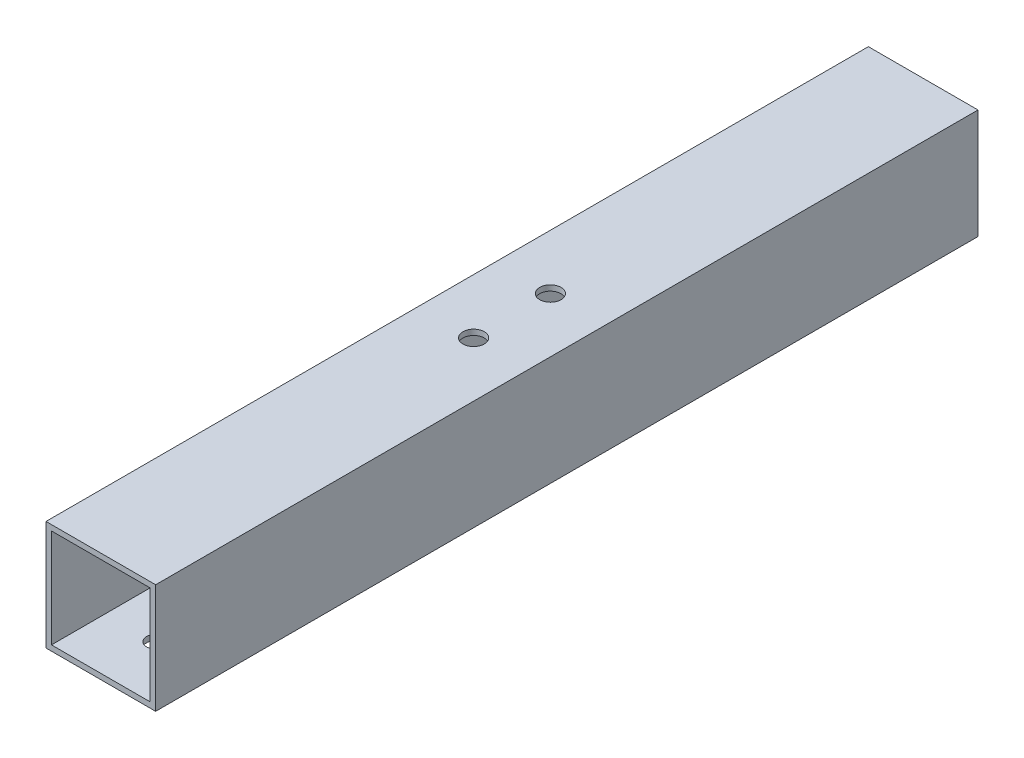
ISO-10303-21;
HEADER;
FILE_DESCRIPTION(('STEP AP214'),'2;1');
FILE_NAME('part.step','',(''),(''),'','','');
FILE_SCHEMA(('AUTOMOTIVE_DESIGN { 1 0 10303 214 1 1 1 1 }'));
ENDSEC;
DATA;
#1=APPLICATION_CONTEXT('core data for automotive mechanical design processes');
#2=APPLICATION_PROTOCOL_DEFINITION('international standard','automotive_design',2000,#1);
#3=PRODUCT_CONTEXT('',#1,'mechanical');
#4=PRODUCT('Part','Part','',(#3));
#5=PRODUCT_RELATED_PRODUCT_CATEGORY('part','',(#4));
#6=PRODUCT_DEFINITION_FORMATION('','',#4);
#7=PRODUCT_DEFINITION_CONTEXT('part definition',#1,'design');
#8=PRODUCT_DEFINITION('design','',#6,#7);
#9=PRODUCT_DEFINITION_SHAPE('','',#8);
#10=(LENGTH_UNIT() NAMED_UNIT(*) SI_UNIT(.MILLI.,.METRE.));
#11=(NAMED_UNIT(*) PLANE_ANGLE_UNIT() SI_UNIT($,.RADIAN.));
#12=(NAMED_UNIT(*) SI_UNIT($,.STERADIAN.) SOLID_ANGLE_UNIT());
#13=UNCERTAINTY_MEASURE_WITH_UNIT(LENGTH_MEASURE(1.E-05),#10,'distance_accuracy_value','');
#14=(GEOMETRIC_REPRESENTATION_CONTEXT(3) GLOBAL_UNCERTAINTY_ASSIGNED_CONTEXT((#13)) GLOBAL_UNIT_ASSIGNED_CONTEXT((#10,
#11,#12)) REPRESENTATION_CONTEXT('',''));
#15=CARTESIAN_POINT('',(0.,0.,0.));
#16=DIRECTION('',(0.,0.,1.));
#17=DIRECTION('',(1.,0.,0.));
#18=AXIS2_PLACEMENT_3D('',#15,#16,#17);
#19=CARTESIAN_POINT('',(0.,0.,150.));
#20=DIRECTION('',(0.,0.,1.));
#21=DIRECTION('',(1.,0.,0.));
#22=AXIS2_PLACEMENT_3D('',#19,#20,#21);
#23=PLANE('',#22);
#24=DIRECTION('',(0.,-1.,0.));
#25=VECTOR('',#24,1.);
#26=CARTESIAN_POINT('',(0.,0.,150.));
#27=LINE('',#26,#25);
#28=CARTESIAN_POINT('',(0.,0.,150.));
#29=VERTEX_POINT('',#28);
#30=CARTESIAN_POINT('',(0.,-20.,150.));
#31=VERTEX_POINT('',#30);
#32=EDGE_CURVE('E170',#29,#31,#27,.T.);
#33=ORIENTED_EDGE('',*,*,#32,.T.);
#34=DIRECTION('',(1.,0.,0.));
#35=VECTOR('',#34,1.);
#36=CARTESIAN_POINT('',(0.,-20.,150.));
#37=LINE('',#36,#35);
#38=CARTESIAN_POINT('',(20.,-20.,150.));
#39=VERTEX_POINT('',#38);
#40=EDGE_CURVE('E173',#31,#39,#37,.T.);
#41=ORIENTED_EDGE('',*,*,#40,.T.);
#42=DIRECTION('',(0.,1.,0.));
#43=VECTOR('',#42,1.);
#44=CARTESIAN_POINT('',(20.,0.,150.));
#45=LINE('',#44,#43);
#46=CARTESIAN_POINT('',(20.,0.,150.));
#47=VERTEX_POINT('',#46);
#48=EDGE_CURVE('E176',#39,#47,#45,.T.);
#49=ORIENTED_EDGE('',*,*,#48,.T.);
#50=DIRECTION('',(-1.,0.,0.));
#51=VECTOR('',#50,1.);
#52=CARTESIAN_POINT('',(0.,0.,150.));
#53=LINE('',#52,#51);
#54=EDGE_CURVE('E178',#47,#29,#53,.T.);
#55=ORIENTED_EDGE('',*,*,#54,.T.);
#56=EDGE_LOOP('',(#33,#41,#49,#55));
#57=FACE_BOUND('',#56,.T.);
#58=DIRECTION('',(1.,0.,0.));
#59=VECTOR('',#58,1.);
#60=CARTESIAN_POINT('',(0.,-19.,150.));
#61=LINE('',#60,#59);
#62=CARTESIAN_POINT('',(1.,-19.,150.));
#63=VERTEX_POINT('',#62);
#64=CARTESIAN_POINT('',(19.,-19.,150.));
#65=VERTEX_POINT('',#64);
#66=EDGE_CURVE('E140',#63,#65,#61,.T.);
#67=ORIENTED_EDGE('',*,*,#66,.F.);
#68=DIRECTION('',(0.,-1.,0.));
#69=VECTOR('',#68,1.);
#70=CARTESIAN_POINT('',(1.,0.,150.));
#71=LINE('',#70,#69);
#72=CARTESIAN_POINT('',(1.,-1.,150.));
#73=VERTEX_POINT('',#72);
#74=EDGE_CURVE('E132',#73,#63,#71,.T.);
#75=ORIENTED_EDGE('',*,*,#74,.F.);
#76=DIRECTION('',(-1.,0.,0.));
#77=VECTOR('',#76,1.);
#78=CARTESIAN_POINT('',(0.,-1.,150.));
#79=LINE('',#78,#77);
#80=CARTESIAN_POINT('',(19.,-1.,150.));
#81=VERTEX_POINT('',#80);
#82=EDGE_CURVE('E154',#81,#73,#79,.T.);
#83=ORIENTED_EDGE('',*,*,#82,.F.);
#84=DIRECTION('',(0.,1.,0.));
#85=VECTOR('',#84,1.);
#86=CARTESIAN_POINT('',(19.,0.,150.));
#87=LINE('',#86,#85);
#88=EDGE_CURVE('E152',#65,#81,#87,.T.);
#89=ORIENTED_EDGE('',*,*,#88,.F.);
#90=EDGE_LOOP('',(#67,#75,#83,#89));
#91=FACE_BOUND('',#90,.T.);
#92=ADVANCED_FACE('F65',(#57,#91),#23,.T.);
#93=CARTESIAN_POINT('',(0.,0.,0.));
#94=DIRECTION('',(0.,0.,1.));
#95=DIRECTION('',(1.,0.,0.));
#96=AXIS2_PLACEMENT_3D('',#93,#94,#95);
#97=PLANE('',#96);
#98=DIRECTION('',(0.,-1.,0.));
#99=VECTOR('',#98,1.);
#100=CARTESIAN_POINT('',(0.,0.,0.));
#101=LINE('',#100,#99);
#102=CARTESIAN_POINT('',(0.,0.,0.));
#103=VERTEX_POINT('',#102);
#104=CARTESIAN_POINT('',(0.,-20.,0.));
#105=VERTEX_POINT('',#104);
#106=EDGE_CURVE('E148',#103,#105,#101,.T.);
#107=ORIENTED_EDGE('',*,*,#106,.F.);
#108=DIRECTION('',(-1.,0.,0.));
#109=VECTOR('',#108,1.);
#110=CARTESIAN_POINT('',(0.,0.,0.));
#111=LINE('',#110,#109);
#112=CARTESIAN_POINT('',(20.,0.,0.));
#113=VERTEX_POINT('',#112);
#114=EDGE_CURVE('E174',#113,#103,#111,.T.);
#115=ORIENTED_EDGE('',*,*,#114,.F.);
#116=DIRECTION('',(0.,1.,0.));
#117=VECTOR('',#116,1.);
#118=CARTESIAN_POINT('',(20.,0.,0.));
#119=LINE('',#118,#117);
#120=CARTESIAN_POINT('',(20.,-20.,0.));
#121=VERTEX_POINT('',#120);
#122=EDGE_CURVE('E185',#121,#113,#119,.T.);
#123=ORIENTED_EDGE('',*,*,#122,.F.);
#124=DIRECTION('',(1.,0.,0.));
#125=VECTOR('',#124,1.);
#126=CARTESIAN_POINT('',(0.,-20.,0.));
#127=LINE('',#126,#125);
#128=EDGE_CURVE('E183',#105,#121,#127,.T.);
#129=ORIENTED_EDGE('',*,*,#128,.F.);
#130=EDGE_LOOP('',(#107,#115,#123,#129));
#131=FACE_BOUND('',#130,.T.);
#132=DIRECTION('',(0.,-1.,0.));
#133=VECTOR('',#132,1.);
#134=CARTESIAN_POINT('',(1.,0.,0.));
#135=LINE('',#134,#133);
#136=CARTESIAN_POINT('',(1.,-1.,0.));
#137=VERTEX_POINT('',#136);
#138=CARTESIAN_POINT('',(1.,-19.,0.));
#139=VERTEX_POINT('',#138);
#140=EDGE_CURVE('E90',#137,#139,#135,.T.);
#141=ORIENTED_EDGE('',*,*,#140,.T.);
#142=DIRECTION('',(1.,0.,0.));
#143=VECTOR('',#142,1.);
#144=CARTESIAN_POINT('',(0.,-19.,0.));
#145=LINE('',#144,#143);
#146=CARTESIAN_POINT('',(19.,-19.,0.));
#147=VERTEX_POINT('',#146);
#148=EDGE_CURVE('E147',#139,#147,#145,.T.);
#149=ORIENTED_EDGE('',*,*,#148,.T.);
#150=DIRECTION('',(0.,1.,0.));
#151=VECTOR('',#150,1.);
#152=CARTESIAN_POINT('',(19.,0.,0.));
#153=LINE('',#152,#151);
#154=CARTESIAN_POINT('',(19.,-1.,0.));
#155=VERTEX_POINT('',#154);
#156=EDGE_CURVE('E162',#147,#155,#153,.T.);
#157=ORIENTED_EDGE('',*,*,#156,.T.);
#158=DIRECTION('',(-1.,0.,0.));
#159=VECTOR('',#158,1.);
#160=CARTESIAN_POINT('',(0.,-1.,0.));
#161=LINE('',#160,#159);
#162=EDGE_CURVE('E141',#155,#137,#161,.T.);
#163=ORIENTED_EDGE('',*,*,#162,.T.);
#164=EDGE_LOOP('',(#141,#149,#157,#163));
#165=FACE_BOUND('',#164,.T.);
#166=ADVANCED_FACE('F236',(#131,#165),#97,.F.);
#167=CARTESIAN_POINT('',(0.,0.,150.));
#168=DIRECTION('',(1.,0.,0.));
#169=DIRECTION('',(0.,1.,0.));
#170=AXIS2_PLACEMENT_3D('',#167,#168,#169);
#171=PLANE('',#170);
#172=ORIENTED_EDGE('',*,*,#106,.T.);
#173=DIRECTION('',(0.,0.,-1.));
#174=VECTOR('',#173,1.);
#175=CARTESIAN_POINT('',(0.,-20.,150.));
#176=LINE('',#175,#174);
#177=EDGE_CURVE('E12',#31,#105,#176,.T.);
#178=ORIENTED_EDGE('',*,*,#177,.F.);
#179=ORIENTED_EDGE('',*,*,#32,.F.);
#180=DIRECTION('',(0.,0.,-1.));
#181=VECTOR('',#180,1.);
#182=CARTESIAN_POINT('',(0.,0.,150.));
#183=LINE('',#182,#181);
#184=EDGE_CURVE('E180',#29,#103,#183,.T.);
#185=ORIENTED_EDGE('',*,*,#184,.T.);
#186=EDGE_LOOP('',(#172,#178,#179,#185));
#187=FACE_BOUND('',#186,.T.);
#188=ADVANCED_FACE('F67',(#187),#171,.F.);
#189=CARTESIAN_POINT('',(0.,-20.,150.));
#190=DIRECTION('',(0.,1.,0.));
#191=DIRECTION('',(0.,0.,1.));
#192=AXIS2_PLACEMENT_3D('',#189,#190,#191);
#193=PLANE('',#192);
#194=CARTESIAN_POINT('',(10.,-20.,140.));
#195=DIRECTION('',(0.,-1.,0.));
#196=DIRECTION('',(0.,0.,-1.));
#197=AXIS2_PLACEMENT_3D('',#194,#195,#196);
#198=CIRCLE('',#197,1.65000000000001);
#199=CARTESIAN_POINT('',(10.,-20.,138.35));
#200=VERTEX_POINT('',#199);
#201=EDGE_CURVE('E218',#200,#200,#198,.T.);
#202=ORIENTED_EDGE('',*,*,#201,.F.);
#203=EDGE_LOOP('',(#202));
#204=FACE_BOUND('',#203,.T.);
#205=CARTESIAN_POINT('',(10.,-20.,9.99999999999998));
#206=DIRECTION('',(0.,-1.,0.));
#207=DIRECTION('',(0.,0.,-1.));
#208=AXIS2_PLACEMENT_3D('',#205,#206,#207);
#209=CIRCLE('',#208,1.65000000000001);
#210=CARTESIAN_POINT('',(10.,-20.,8.34999999999997));
#211=VERTEX_POINT('',#210);
#212=EDGE_CURVE('E276',#211,#211,#209,.T.);
#213=ORIENTED_EDGE('',*,*,#212,.F.);
#214=EDGE_LOOP('',(#213));
#215=FACE_BOUND('',#214,.T.);
#216=CARTESIAN_POINT('',(10.,-20.,82.));
#217=DIRECTION('',(0.,-1.,0.));
#218=DIRECTION('',(0.,0.,-1.));
#219=AXIS2_PLACEMENT_3D('',#216,#217,#218);
#220=CIRCLE('',#219,1.95);
#221=CARTESIAN_POINT('',(10.,-20.,80.05));
#222=VERTEX_POINT('',#221);
#223=EDGE_CURVE('E203',#222,#222,#220,.T.);
#224=ORIENTED_EDGE('',*,*,#223,.F.);
#225=EDGE_LOOP('',(#224));
#226=FACE_BOUND('',#225,.T.);
#227=CARTESIAN_POINT('',(10.,-20.,68.));
#228=DIRECTION('',(0.,-1.,0.));
#229=DIRECTION('',(0.,0.,-1.));
#230=AXIS2_PLACEMENT_3D('',#227,#228,#229);
#231=CIRCLE('',#230,1.95);
#232=CARTESIAN_POINT('',(10.,-20.,66.05));
#233=VERTEX_POINT('',#232);
#234=EDGE_CURVE('E208',#233,#233,#231,.T.);
#235=ORIENTED_EDGE('',*,*,#234,.F.);
#236=EDGE_LOOP('',(#235));
#237=FACE_BOUND('',#236,.T.);
#238=ORIENTED_EDGE('',*,*,#128,.T.);
#239=DIRECTION('',(0.,0.,-1.));
#240=VECTOR('',#239,1.);
#241=CARTESIAN_POINT('',(20.,-20.,150.));
#242=LINE('',#241,#240);
#243=EDGE_CURVE('E74',#39,#121,#242,.T.);
#244=ORIENTED_EDGE('',*,*,#243,.F.);
#245=ORIENTED_EDGE('',*,*,#40,.F.);
#246=ORIENTED_EDGE('',*,*,#177,.T.);
#247=EDGE_LOOP('',(#238,#244,#245,#246));
#248=FACE_BOUND('',#247,.T.);
#249=ADVANCED_FACE('F261',(#204,#215,#226,#237,#248),#193,.F.);
#250=CARTESIAN_POINT('',(20.,0.,150.));
#251=DIRECTION('',(-1.,0.,0.));
#252=DIRECTION('',(0.,-1.,0.));
#253=AXIS2_PLACEMENT_3D('',#250,#251,#252);
#254=PLANE('',#253);
#255=ORIENTED_EDGE('',*,*,#122,.T.);
#256=DIRECTION('',(0.,0.,-1.));
#257=VECTOR('',#256,1.);
#258=CARTESIAN_POINT('',(20.,0.,150.));
#259=LINE('',#258,#257);
#260=EDGE_CURVE('E190',#47,#113,#259,.T.);
#261=ORIENTED_EDGE('',*,*,#260,.F.);
#262=ORIENTED_EDGE('',*,*,#48,.F.);
#263=ORIENTED_EDGE('',*,*,#243,.T.);
#264=EDGE_LOOP('',(#255,#261,#262,#263));
#265=FACE_BOUND('',#264,.T.);
#266=ADVANCED_FACE('F259',(#265),#254,.F.);
#267=CARTESIAN_POINT('',(0.,0.,150.));
#268=DIRECTION('',(0.,-1.,0.));
#269=DIRECTION('',(0.,0.,-1.));
#270=AXIS2_PLACEMENT_3D('',#267,#268,#269);
#271=PLANE('',#270);
#272=CARTESIAN_POINT('',(10.,0.,82.));
#273=DIRECTION('',(0.,-1.,0.));
#274=DIRECTION('',(0.,0.,-1.));
#275=AXIS2_PLACEMENT_3D('',#272,#273,#274);
#276=CIRCLE('',#275,1.95);
#277=CARTESIAN_POINT('',(10.,0.,80.05));
#278=VERTEX_POINT('',#277);
#279=EDGE_CURVE('E197',#278,#278,#276,.T.);
#280=ORIENTED_EDGE('',*,*,#279,.T.);
#281=EDGE_LOOP('',(#280));
#282=FACE_BOUND('',#281,.T.);
#283=CARTESIAN_POINT('',(10.,0.,68.));
#284=DIRECTION('',(0.,-1.,0.));
#285=DIRECTION('',(0.,0.,-1.));
#286=AXIS2_PLACEMENT_3D('',#283,#284,#285);
#287=CIRCLE('',#286,1.95);
#288=CARTESIAN_POINT('',(10.,0.,66.05));
#289=VERTEX_POINT('',#288);
#290=EDGE_CURVE('E216',#289,#289,#287,.T.);
#291=ORIENTED_EDGE('',*,*,#290,.T.);
#292=EDGE_LOOP('',(#291));
#293=FACE_BOUND('',#292,.T.);
#294=ORIENTED_EDGE('',*,*,#114,.T.);
#295=ORIENTED_EDGE('',*,*,#184,.F.);
#296=ORIENTED_EDGE('',*,*,#54,.F.);
#297=ORIENTED_EDGE('',*,*,#260,.T.);
#298=EDGE_LOOP('',(#294,#295,#296,#297));
#299=FACE_BOUND('',#298,.T.);
#300=ADVANCED_FACE('F257',(#282,#293,#299),#271,.F.);
#301=CARTESIAN_POINT('',(1.,0.,150.));
#302=DIRECTION('',(1.,0.,0.));
#303=DIRECTION('',(0.,1.,0.));
#304=AXIS2_PLACEMENT_3D('',#301,#302,#303);
#305=PLANE('',#304);
#306=ORIENTED_EDGE('',*,*,#140,.F.);
#307=DIRECTION('',(0.,0.,-1.));
#308=VECTOR('',#307,1.);
#309=CARTESIAN_POINT('',(1.,-1.,150.));
#310=LINE('',#309,#308);
#311=EDGE_CURVE('E136',#73,#137,#310,.T.);
#312=ORIENTED_EDGE('',*,*,#311,.F.);
#313=ORIENTED_EDGE('',*,*,#74,.T.);
#314=DIRECTION('',(0.,0.,-1.));
#315=VECTOR('',#314,1.);
#316=CARTESIAN_POINT('',(1.,-19.,150.));
#317=LINE('',#316,#315);
#318=EDGE_CURVE('E135',#63,#139,#317,.T.);
#319=ORIENTED_EDGE('',*,*,#318,.T.);
#320=EDGE_LOOP('',(#306,#312,#313,#319));
#321=FACE_BOUND('',#320,.T.);
#322=ADVANCED_FACE('F134',(#321),#305,.T.);
#323=CARTESIAN_POINT('',(0.,-19.,150.));
#324=DIRECTION('',(0.,1.,0.));
#325=DIRECTION('',(0.,0.,1.));
#326=AXIS2_PLACEMENT_3D('',#323,#324,#325);
#327=PLANE('',#326);
#328=CARTESIAN_POINT('',(10.,-19.,140.));
#329=DIRECTION('',(0.,1.,0.));
#330=DIRECTION('',(0.,0.,1.));
#331=AXIS2_PLACEMENT_3D('',#328,#329,#330);
#332=CIRCLE('',#331,1.65000000000001);
#333=CARTESIAN_POINT('',(10.,-19.,141.65));
#334=VERTEX_POINT('',#333);
#335=EDGE_CURVE('E352',#334,#334,#332,.F.);
#336=ORIENTED_EDGE('',*,*,#335,.T.);
#337=EDGE_LOOP('',(#336));
#338=FACE_BOUND('',#337,.T.);
#339=CARTESIAN_POINT('',(10.,-19.,9.99999999999998));
#340=DIRECTION('',(0.,1.,0.));
#341=DIRECTION('',(0.,0.,1.));
#342=AXIS2_PLACEMENT_3D('',#339,#340,#341);
#343=CIRCLE('',#342,1.65000000000001);
#344=CARTESIAN_POINT('',(10.,-19.,11.65));
#345=VERTEX_POINT('',#344);
#346=EDGE_CURVE('E211',#345,#345,#343,.F.);
#347=ORIENTED_EDGE('',*,*,#346,.T.);
#348=EDGE_LOOP('',(#347));
#349=FACE_BOUND('',#348,.T.);
#350=CARTESIAN_POINT('',(10.,-19.,82.));
#351=DIRECTION('',(0.,1.,0.));
#352=DIRECTION('',(0.,0.,1.));
#353=AXIS2_PLACEMENT_3D('',#350,#351,#352);
#354=CIRCLE('',#353,1.95);
#355=CARTESIAN_POINT('',(10.,-19.,83.95));
#356=VERTEX_POINT('',#355);
#357=EDGE_CURVE('E160',#356,#356,#354,.T.);
#358=ORIENTED_EDGE('',*,*,#357,.F.);
#359=EDGE_LOOP('',(#358));
#360=FACE_BOUND('',#359,.T.);
#361=CARTESIAN_POINT('',(10.,-19.,68.));
#362=DIRECTION('',(0.,1.,0.));
#363=DIRECTION('',(0.,0.,1.));
#364=AXIS2_PLACEMENT_3D('',#361,#362,#363);
#365=CIRCLE('',#364,1.95);
#366=CARTESIAN_POINT('',(10.,-19.,69.95));
#367=VERTEX_POINT('',#366);
#368=EDGE_CURVE('E196',#367,#367,#365,.T.);
#369=ORIENTED_EDGE('',*,*,#368,.F.);
#370=EDGE_LOOP('',(#369));
#371=FACE_BOUND('',#370,.T.);
#372=ORIENTED_EDGE('',*,*,#148,.F.);
#373=ORIENTED_EDGE('',*,*,#318,.F.);
#374=ORIENTED_EDGE('',*,*,#66,.T.);
#375=DIRECTION('',(0.,0.,-1.));
#376=VECTOR('',#375,1.);
#377=CARTESIAN_POINT('',(19.,-19.,150.));
#378=LINE('',#377,#376);
#379=EDGE_CURVE('E149',#65,#147,#378,.T.);
#380=ORIENTED_EDGE('',*,*,#379,.T.);
#381=EDGE_LOOP('',(#372,#373,#374,#380));
#382=FACE_BOUND('',#381,.T.);
#383=ADVANCED_FACE('F144',(#338,#349,#360,#371,#382),#327,.T.);
#384=CARTESIAN_POINT('',(19.,0.,150.));
#385=DIRECTION('',(-1.,0.,0.));
#386=DIRECTION('',(0.,-1.,0.));
#387=AXIS2_PLACEMENT_3D('',#384,#385,#386);
#388=PLANE('',#387);
#389=ORIENTED_EDGE('',*,*,#156,.F.);
#390=ORIENTED_EDGE('',*,*,#379,.F.);
#391=ORIENTED_EDGE('',*,*,#88,.T.);
#392=DIRECTION('',(0.,0.,-1.));
#393=VECTOR('',#392,1.);
#394=CARTESIAN_POINT('',(19.,-1.,150.));
#395=LINE('',#394,#393);
#396=EDGE_CURVE('E82',#81,#155,#395,.T.);
#397=ORIENTED_EDGE('',*,*,#396,.T.);
#398=EDGE_LOOP('',(#389,#390,#391,#397));
#399=FACE_BOUND('',#398,.T.);
#400=ADVANCED_FACE('F232',(#399),#388,.T.);
#401=CARTESIAN_POINT('',(0.,-1.,150.));
#402=DIRECTION('',(0.,-1.,0.));
#403=DIRECTION('',(0.,0.,-1.));
#404=AXIS2_PLACEMENT_3D('',#401,#402,#403);
#405=PLANE('',#404);
#406=CARTESIAN_POINT('',(10.,-1.,82.));
#407=DIRECTION('',(0.,-1.,0.));
#408=DIRECTION('',(0.,0.,-1.));
#409=AXIS2_PLACEMENT_3D('',#406,#407,#408);
#410=CIRCLE('',#409,1.95);
#411=CARTESIAN_POINT('',(10.,-1.,80.05));
#412=VERTEX_POINT('',#411);
#413=EDGE_CURVE('E69',#412,#412,#410,.T.);
#414=ORIENTED_EDGE('',*,*,#413,.F.);
#415=EDGE_LOOP('',(#414));
#416=FACE_BOUND('',#415,.T.);
#417=CARTESIAN_POINT('',(10.,-1.,68.));
#418=DIRECTION('',(0.,-1.,0.));
#419=DIRECTION('',(0.,0.,-1.));
#420=AXIS2_PLACEMENT_3D('',#417,#418,#419);
#421=CIRCLE('',#420,1.95);
#422=CARTESIAN_POINT('',(10.,-1.,66.05));
#423=VERTEX_POINT('',#422);
#424=EDGE_CURVE('E194',#423,#423,#421,.T.);
#425=ORIENTED_EDGE('',*,*,#424,.F.);
#426=EDGE_LOOP('',(#425));
#427=FACE_BOUND('',#426,.T.);
#428=ORIENTED_EDGE('',*,*,#162,.F.);
#429=ORIENTED_EDGE('',*,*,#396,.F.);
#430=ORIENTED_EDGE('',*,*,#82,.T.);
#431=ORIENTED_EDGE('',*,*,#311,.T.);
#432=EDGE_LOOP('',(#428,#429,#430,#431));
#433=FACE_BOUND('',#432,.T.);
#434=ADVANCED_FACE('F228',(#416,#427,#433),#405,.T.);
#435=CARTESIAN_POINT('',(10.,0.,68.));
#436=DIRECTION('',(0.,-1.,0.));
#437=DIRECTION('',(0.,0.,-1.));
#438=AXIS2_PLACEMENT_3D('',#435,#436,#437);
#439=CYLINDRICAL_SURFACE('',#438,1.95);
#440=ORIENTED_EDGE('',*,*,#424,.T.);
#441=EDGE_LOOP('',(#440));
#442=FACE_BOUND('',#441,.T.);
#443=ORIENTED_EDGE('',*,*,#290,.F.);
#444=EDGE_LOOP('',(#443));
#445=FACE_BOUND('',#444,.T.);
#446=ADVANCED_FACE('F231',(#442,#445),#439,.F.);
#447=CARTESIAN_POINT('',(10.,0.,82.));
#448=DIRECTION('',(0.,-1.,0.));
#449=DIRECTION('',(0.,0.,-1.));
#450=AXIS2_PLACEMENT_3D('',#447,#448,#449);
#451=CYLINDRICAL_SURFACE('',#450,1.95);
#452=ORIENTED_EDGE('',*,*,#413,.T.);
#453=EDGE_LOOP('',(#452));
#454=FACE_BOUND('',#453,.T.);
#455=ORIENTED_EDGE('',*,*,#279,.F.);
#456=EDGE_LOOP('',(#455));
#457=FACE_BOUND('',#456,.T.);
#458=ADVANCED_FACE('F225',(#454,#457),#451,.F.);
#459=ORIENTED_EDGE('',*,*,#368,.T.);
#460=EDGE_LOOP('',(#459));
#461=FACE_BOUND('',#460,.T.);
#462=ORIENTED_EDGE('',*,*,#234,.T.);
#463=EDGE_LOOP('',(#462));
#464=FACE_BOUND('',#463,.T.);
#465=ADVANCED_FACE('F293',(#461,#464),#439,.F.);
#466=ORIENTED_EDGE('',*,*,#357,.T.);
#467=EDGE_LOOP('',(#466));
#468=FACE_BOUND('',#467,.T.);
#469=ORIENTED_EDGE('',*,*,#223,.T.);
#470=EDGE_LOOP('',(#469));
#471=FACE_BOUND('',#470,.T.);
#472=ADVANCED_FACE('F295',(#468,#471),#451,.F.);
#473=CARTESIAN_POINT('',(10.,0.001000000000001,9.99999999999998));
#474=DIRECTION('',(0.,-1.,0.));
#475=DIRECTION('',(0.,0.,-1.));
#476=AXIS2_PLACEMENT_3D('',#473,#474,#475);
#477=CYLINDRICAL_SURFACE('',#476,1.65000000000001);
#478=ORIENTED_EDGE('',*,*,#346,.F.);
#479=EDGE_LOOP('',(#478));
#480=FACE_BOUND('',#479,.T.);
#481=ORIENTED_EDGE('',*,*,#212,.T.);
#482=EDGE_LOOP('',(#481));
#483=FACE_BOUND('',#482,.T.);
#484=ADVANCED_FACE('F301',(#480,#483),#477,.F.);
#485=CARTESIAN_POINT('',(10.,0.001000000000001,140.));
#486=DIRECTION('',(0.,-1.,0.));
#487=DIRECTION('',(0.,0.,-1.));
#488=AXIS2_PLACEMENT_3D('',#485,#486,#487);
#489=CYLINDRICAL_SURFACE('',#488,1.65000000000001);
#490=ORIENTED_EDGE('',*,*,#335,.F.);
#491=EDGE_LOOP('',(#490));
#492=FACE_BOUND('',#491,.T.);
#493=ORIENTED_EDGE('',*,*,#201,.T.);
#494=EDGE_LOOP('',(#493));
#495=FACE_BOUND('',#494,.T.);
#496=ADVANCED_FACE('F336',(#492,#495),#489,.F.);
#497=CLOSED_SHELL('',(#92,#166,#188,#249,#266,#300,#322,#383,#400,#434,#446,#458,#465,#472,#484,#496));
#498=MANIFOLD_SOLID_BREP('B2',#497);
#499=ADVANCED_BREP_SHAPE_REPRESENTATION('',(#18,#498),#14);
#500=SHAPE_DEFINITION_REPRESENTATION(#9,#499);
ENDSEC;
END-ISO-10303-21;
